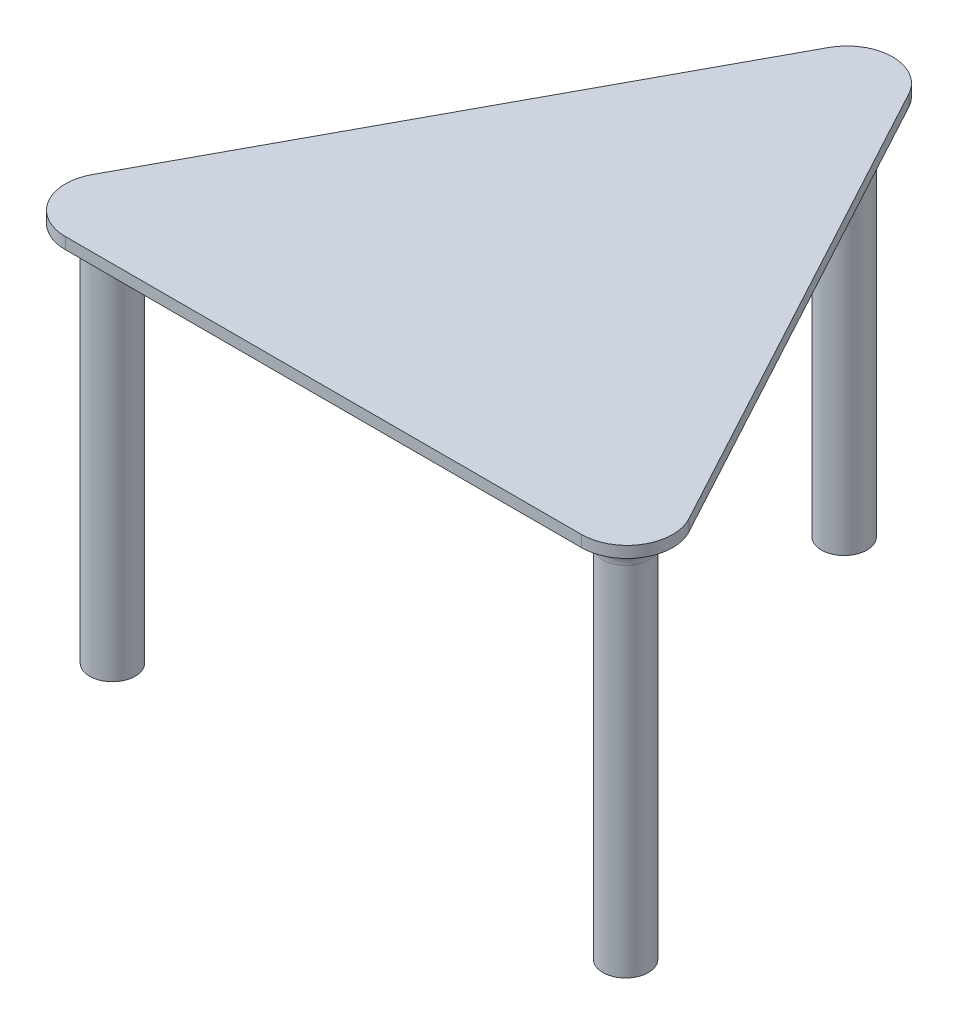
ISO-10303-21;
HEADER;
FILE_DESCRIPTION(('STEP AP214'),'2;1');
FILE_NAME('part.step','',(''),(''),'','','');
FILE_SCHEMA(('AUTOMOTIVE_DESIGN { 1 0 10303 214 1 1 1 1 }'));
ENDSEC;
DATA;
#1=APPLICATION_CONTEXT('core data for automotive mechanical design processes');
#2=APPLICATION_PROTOCOL_DEFINITION('international standard','automotive_design',2000,#1);
#3=PRODUCT_CONTEXT('',#1,'mechanical');
#4=PRODUCT('Part','Part','',(#3));
#5=PRODUCT_RELATED_PRODUCT_CATEGORY('part','',(#4));
#6=PRODUCT_DEFINITION_FORMATION('','',#4);
#7=PRODUCT_DEFINITION_CONTEXT('part definition',#1,'design');
#8=PRODUCT_DEFINITION('design','',#6,#7);
#9=PRODUCT_DEFINITION_SHAPE('','',#8);
#10=(LENGTH_UNIT() NAMED_UNIT(*) SI_UNIT(.MILLI.,.METRE.));
#11=(NAMED_UNIT(*) PLANE_ANGLE_UNIT() SI_UNIT($,.RADIAN.));
#12=(NAMED_UNIT(*) SI_UNIT($,.STERADIAN.) SOLID_ANGLE_UNIT());
#13=UNCERTAINTY_MEASURE_WITH_UNIT(LENGTH_MEASURE(1.E-05),#10,'distance_accuracy_value','');
#14=(GEOMETRIC_REPRESENTATION_CONTEXT(3) GLOBAL_UNCERTAINTY_ASSIGNED_CONTEXT((#13)) GLOBAL_UNIT_ASSIGNED_CONTEXT((#10,
#11,#12)) REPRESENTATION_CONTEXT('',''));
#15=CARTESIAN_POINT('',(0.,0.,0.));
#16=DIRECTION('',(0.,0.,1.));
#17=DIRECTION('',(1.,0.,0.));
#18=AXIS2_PLACEMENT_3D('',#15,#16,#17);
#19=CARTESIAN_POINT('',(0.,1.2,21.9757326007326));
#20=DIRECTION('',(0.,0.,-1.));
#21=DIRECTION('',(-1.,0.,0.));
#22=AXIS2_PLACEMENT_3D('',#19,#20,#21);
#23=PLANE('',#22);
#24=DIRECTION('',(1.,0.,0.));
#25=VECTOR('',#24,1.);
#26=CARTESIAN_POINT('',(0.,0.,21.9757326007326));
#27=LINE('',#26,#25);
#28=CARTESIAN_POINT('',(-68.0914658167259,0.,21.9757326007326));
#29=VERTEX_POINT('',#28);
#30=CARTESIAN_POINT('',(-67.9377289377289,0.,21.9757326007326));
#31=VERTEX_POINT('',#30);
#32=EDGE_CURVE('E252',#29,#31,#27,.T.);
#33=ORIENTED_EDGE('',*,*,#32,.T.);
#34=CARTESIAN_POINT('',(-13.9377289377289,0.,21.9757326007326));
#35=VERTEX_POINT('',#34);
#36=EDGE_CURVE('E255',#31,#35,#27,.T.);
#37=ORIENTED_EDGE('',*,*,#36,.T.);
#38=CARTESIAN_POINT('',(-13.7839920587319,0.,21.9757326007326));
#39=VERTEX_POINT('',#38);
#40=EDGE_CURVE('E115',#35,#39,#27,.T.);
#41=ORIENTED_EDGE('',*,*,#40,.T.);
#42=DIRECTION('',(0.,-1.,0.));
#43=VECTOR('',#42,1.);
#44=CARTESIAN_POINT('',(-13.7839920587319,1.2,21.9757326007326));
#45=LINE('',#44,#43);
#46=CARTESIAN_POINT('',(-13.7839920587319,1.2,21.9757326007326));
#47=VERTEX_POINT('',#46);
#48=EDGE_CURVE('E96',#47,#39,#45,.T.);
#49=ORIENTED_EDGE('',*,*,#48,.F.);
#50=DIRECTION('',(1.,0.,0.));
#51=VECTOR('',#50,1.);
#52=CARTESIAN_POINT('',(0.,1.2,21.9757326007326));
#53=LINE('',#52,#51);
#54=CARTESIAN_POINT('',(-68.0914658167259,1.2,21.9757326007326));
#55=VERTEX_POINT('',#54);
#56=EDGE_CURVE('E102',#55,#47,#53,.T.);
#57=ORIENTED_EDGE('',*,*,#56,.F.);
#58=DIRECTION('',(0.,-1.,0.));
#59=VECTOR('',#58,1.);
#60=CARTESIAN_POINT('',(-68.0914658167259,1.2,21.9757326007326));
#61=LINE('',#60,#59);
#62=EDGE_CURVE('E251',#55,#29,#61,.T.);
#63=ORIENTED_EDGE('',*,*,#62,.T.);
#64=EDGE_LOOP('',(#33,#37,#41,#49,#57,#63));
#65=FACE_BOUND('',#64,.T.);
#66=ADVANCED_FACE('F35',(#65),#23,.F.);
#67=CARTESIAN_POINT('',(-13.7839920587319,1.2,17.1757326007326));
#68=DIRECTION('',(0.,-1.,0.));
#69=DIRECTION('',(0.,0.,-1.));
#70=AXIS2_PLACEMENT_3D('',#67,#68,#69);
#71=CYLINDRICAL_SURFACE('',#70,4.8);
#72=CARTESIAN_POINT('',(-13.7839920587319,0.,17.1757326007326));
#73=DIRECTION('',(0.,1.,0.));
#74=DIRECTION('',(0.,0.,1.));
#75=AXIS2_PLACEMENT_3D('',#72,#73,#74);
#76=CIRCLE('',#75,4.8);
#77=CARTESIAN_POINT('',(-9.56022949463293,0.,14.8954190691945));
#78=VERTEX_POINT('',#77);
#79=EDGE_CURVE('E254',#39,#78,#76,.T.);
#80=ORIENTED_EDGE('',*,*,#79,.T.);
#81=DIRECTION('',(0.,-1.,0.));
#82=VECTOR('',#81,1.);
#83=CARTESIAN_POINT('',(-9.56022949463293,1.2,14.8954190691945));
#84=LINE('',#83,#82);
#85=CARTESIAN_POINT('',(-9.56022949463293,1.2,14.8954190691945));
#86=VERTEX_POINT('',#85);
#87=EDGE_CURVE('E98',#86,#78,#84,.T.);
#88=ORIENTED_EDGE('',*,*,#87,.F.);
#89=CARTESIAN_POINT('',(-13.7839920587319,1.2,17.1757326007326));
#90=DIRECTION('',(0.,1.,0.));
#91=DIRECTION('',(0.,0.,1.));
#92=AXIS2_PLACEMENT_3D('',#89,#90,#91);
#93=CIRCLE('',#92,4.8);
#94=EDGE_CURVE('E92',#47,#86,#93,.T.);
#95=ORIENTED_EDGE('',*,*,#94,.F.);
#96=ORIENTED_EDGE('',*,*,#48,.T.);
#97=EDGE_LOOP('',(#80,#88,#95,#96));
#98=FACE_BOUND('',#97,.T.);
#99=ADVANCED_FACE('F94',(#98),#71,.T.);
#100=CARTESIAN_POINT('',(-13.629400768555,1.2,7.358204095907));
#101=DIRECTION('',(-0.879950534187292,0.,0.47506531907044));
#102=DIRECTION('',(0.47506531907044,0.,0.879950534187292));
#103=AXIS2_PLACEMENT_3D('',#100,#101,#102);
#104=PLANE('',#103);
#105=DIRECTION('',(-0.47506531907044,0.,-0.879950534187292));
#106=VECTOR('',#105,1.);
#107=CARTESIAN_POINT('',(-13.629400768555,0.,7.358204095907));
#108=LINE('',#107,#106);
#109=CARTESIAN_POINT('',(-36.7139663736299,0.,-35.4007071953113));
#110=VERTEX_POINT('',#109);
#111=EDGE_CURVE('E257',#78,#110,#108,.T.);
#112=ORIENTED_EDGE('',*,*,#111,.T.);
#113=DIRECTION('',(0.,-1.,0.));
#114=VECTOR('',#113,1.);
#115=CARTESIAN_POINT('',(-36.7139663736299,1.2,-35.4007071953113));
#116=LINE('',#115,#114);
#117=CARTESIAN_POINT('',(-36.7139663736299,1.2,-35.4007071953113));
#118=VERTEX_POINT('',#117);
#119=EDGE_CURVE('E122',#118,#110,#116,.T.);
#120=ORIENTED_EDGE('',*,*,#119,.F.);
#121=DIRECTION('',(-0.47506531907044,0.,-0.879950534187292));
#122=VECTOR('',#121,1.);
#123=CARTESIAN_POINT('',(-13.629400768555,1.2,7.358204095907));
#124=LINE('',#123,#122);
#125=EDGE_CURVE('E101',#86,#118,#124,.T.);
#126=ORIENTED_EDGE('',*,*,#125,.F.);
#127=ORIENTED_EDGE('',*,*,#87,.T.);
#128=EDGE_LOOP('',(#112,#120,#126,#127));
#129=FACE_BOUND('',#128,.T.);
#130=ADVANCED_FACE('F160',(#129),#104,.F.);
#131=CARTESIAN_POINT('',(-40.9377289377289,1.2,-33.1203936637732));
#132=DIRECTION('',(0.,-1.,0.));
#133=DIRECTION('',(0.,0.,-1.));
#134=AXIS2_PLACEMENT_3D('',#131,#132,#133);
#135=CYLINDRICAL_SURFACE('',#134,4.8);
#136=CARTESIAN_POINT('',(-40.9377289377289,0.,-33.1203936637732));
#137=DIRECTION('',(0.,1.,0.));
#138=DIRECTION('',(0.,0.,1.));
#139=AXIS2_PLACEMENT_3D('',#136,#137,#138);
#140=CIRCLE('',#139,4.8);
#141=CARTESIAN_POINT('',(-45.1614915018279,0.,-35.4007071953113));
#142=VERTEX_POINT('',#141);
#143=EDGE_CURVE('E259',#110,#142,#140,.T.);
#144=ORIENTED_EDGE('',*,*,#143,.T.);
#145=DIRECTION('',(0.,-1.,0.));
#146=VECTOR('',#145,1.);
#147=CARTESIAN_POINT('',(-45.1614915018279,1.2,-35.4007071953113));
#148=LINE('',#147,#146);
#149=CARTESIAN_POINT('',(-45.1614915018279,1.2,-35.4007071953113));
#150=VERTEX_POINT('',#149);
#151=EDGE_CURVE('E269',#150,#142,#148,.T.);
#152=ORIENTED_EDGE('',*,*,#151,.F.);
#153=CARTESIAN_POINT('',(-40.9377289377289,1.2,-33.1203936637732));
#154=DIRECTION('',(0.,1.,0.));
#155=DIRECTION('',(0.,0.,1.));
#156=AXIS2_PLACEMENT_3D('',#153,#154,#155);
#157=CIRCLE('',#156,4.8);
#158=EDGE_CURVE('E246',#118,#150,#157,.T.);
#159=ORIENTED_EDGE('',*,*,#158,.F.);
#160=ORIENTED_EDGE('',*,*,#119,.T.);
#161=EDGE_LOOP('',(#144,#152,#159,#160));
#162=FACE_BOUND('',#161,.T.);
#163=ADVANCED_FACE('F165',(#162),#135,.T.);
#164=CARTESIAN_POINT('',(-49.7678259470641,1.2,-26.8685195297033));
#165=DIRECTION('',(0.879950534187292,0.,0.47506531907044));
#166=DIRECTION('',(0.47506531907044,0.,-0.879950534187292));
#167=AXIS2_PLACEMENT_3D('',#164,#165,#166);
#168=PLANE('',#167);
#169=DIRECTION('',(-0.47506531907044,0.,0.879950534187292));
#170=VECTOR('',#169,1.);
#171=CARTESIAN_POINT('',(-49.7678259470641,0.,-26.8685195297033));
#172=LINE('',#171,#170);
#173=CARTESIAN_POINT('',(-72.3152283808249,0.,14.8954190691945));
#174=VERTEX_POINT('',#173);
#175=EDGE_CURVE('E261',#142,#174,#172,.T.);
#176=ORIENTED_EDGE('',*,*,#175,.T.);
#177=DIRECTION('',(0.,-1.,0.));
#178=VECTOR('',#177,1.);
#179=CARTESIAN_POINT('',(-72.3152283808249,1.2,14.8954190691945));
#180=LINE('',#179,#178);
#181=CARTESIAN_POINT('',(-72.3152283808249,1.2,14.8954190691945));
#182=VERTEX_POINT('',#181);
#183=EDGE_CURVE('E267',#182,#174,#180,.T.);
#184=ORIENTED_EDGE('',*,*,#183,.F.);
#185=DIRECTION('',(-0.47506531907044,0.,0.879950534187292));
#186=VECTOR('',#185,1.);
#187=CARTESIAN_POINT('',(-49.7678259470641,1.2,-26.8685195297033));
#188=LINE('',#187,#186);
#189=EDGE_CURVE('E248',#150,#182,#188,.T.);
#190=ORIENTED_EDGE('',*,*,#189,.F.);
#191=ORIENTED_EDGE('',*,*,#151,.T.);
#192=EDGE_LOOP('',(#176,#184,#190,#191));
#193=FACE_BOUND('',#192,.T.);
#194=ADVANCED_FACE('F169',(#193),#168,.F.);
#195=CARTESIAN_POINT('',(-68.0914658167259,1.2,17.1757326007326));
#196=DIRECTION('',(0.,-1.,0.));
#197=DIRECTION('',(0.,0.,-1.));
#198=AXIS2_PLACEMENT_3D('',#195,#196,#197);
#199=CYLINDRICAL_SURFACE('',#198,4.8);
#200=CARTESIAN_POINT('',(-68.0914658167259,0.,17.1757326007326));
#201=DIRECTION('',(0.,1.,0.));
#202=DIRECTION('',(0.,0.,1.));
#203=AXIS2_PLACEMENT_3D('',#200,#201,#202);
#204=CIRCLE('',#203,4.8);
#205=EDGE_CURVE('E110',#29,#174,#204,.F.);
#206=ORIENTED_EDGE('',*,*,#205,.F.);
#207=ORIENTED_EDGE('',*,*,#62,.F.);
#208=CARTESIAN_POINT('',(-68.0914658167259,1.2,17.1757326007326));
#209=DIRECTION('',(0.,1.,0.));
#210=DIRECTION('',(0.,0.,1.));
#211=AXIS2_PLACEMENT_3D('',#208,#209,#210);
#212=CIRCLE('',#211,4.8);
#213=EDGE_CURVE('E108',#55,#182,#212,.F.);
#214=ORIENTED_EDGE('',*,*,#213,.T.);
#215=ORIENTED_EDGE('',*,*,#183,.T.);
#216=EDGE_LOOP('',(#206,#207,#214,#215));
#217=FACE_BOUND('',#216,.T.);
#218=ADVANCED_FACE('F173',(#217),#199,.T.);
#219=CARTESIAN_POINT('',(0.,1.2,0.));
#220=DIRECTION('',(0.,1.,0.));
#221=DIRECTION('',(0.,0.,1.));
#222=AXIS2_PLACEMENT_3D('',#219,#220,#221);
#223=PLANE('',#222);
#224=ORIENTED_EDGE('',*,*,#56,.T.);
#225=ORIENTED_EDGE('',*,*,#94,.T.);
#226=ORIENTED_EDGE('',*,*,#125,.T.);
#227=ORIENTED_EDGE('',*,*,#158,.T.);
#228=ORIENTED_EDGE('',*,*,#189,.T.);
#229=ORIENTED_EDGE('',*,*,#213,.F.);
#230=EDGE_LOOP('',(#224,#225,#226,#227,#228,#229));
#231=FACE_BOUND('',#230,.T.);
#232=ADVANCED_FACE('F106',(#231),#223,.T.);
#233=CARTESIAN_POINT('',(0.,0.,0.));
#234=DIRECTION('',(0.,1.,0.));
#235=DIRECTION('',(0.,0.,1.));
#236=AXIS2_PLACEMENT_3D('',#233,#234,#235);
#237=PLANE('',#236);
#238=CARTESIAN_POINT('',(-40.9377289377289,0.,-32.8242673992674));
#239=DIRECTION('',(0.,1.,0.));
#240=DIRECTION('',(0.,0.,1.));
#241=AXIS2_PLACEMENT_3D('',#238,#239,#240);
#242=CIRCLE('',#241,4.8);
#243=CARTESIAN_POINT('',(-40.9377289377289,0.,-28.0242673992674));
#244=VERTEX_POINT('',#243);
#245=EDGE_CURVE('E131',#244,#244,#242,.T.);
#246=ORIENTED_EDGE('',*,*,#245,.T.);
#247=EDGE_LOOP('',(#246));
#248=FACE_BOUND('',#247,.T.);
#249=ORIENTED_EDGE('',*,*,#36,.F.);
#250=CARTESIAN_POINT('',(-67.9377289377289,0.,17.1757326007326));
#251=DIRECTION('',(0.,1.,0.));
#252=DIRECTION('',(0.,0.,1.));
#253=AXIS2_PLACEMENT_3D('',#250,#251,#252);
#254=CIRCLE('',#253,4.8);
#255=EDGE_CURVE('E53',#31,#31,#254,.T.);
#256=ORIENTED_EDGE('',*,*,#255,.T.);
#257=ORIENTED_EDGE('',*,*,#32,.F.);
#258=ORIENTED_EDGE('',*,*,#205,.T.);
#259=ORIENTED_EDGE('',*,*,#175,.F.);
#260=ORIENTED_EDGE('',*,*,#143,.F.);
#261=ORIENTED_EDGE('',*,*,#111,.F.);
#262=ORIENTED_EDGE('',*,*,#79,.F.);
#263=ORIENTED_EDGE('',*,*,#40,.F.);
#264=CARTESIAN_POINT('',(-13.9377289377289,0.,17.1757326007326));
#265=DIRECTION('',(0.,1.,0.));
#266=DIRECTION('',(0.,0.,1.));
#267=AXIS2_PLACEMENT_3D('',#264,#265,#266);
#268=CIRCLE('',#267,4.8);
#269=EDGE_CURVE('E48',#35,#35,#268,.T.);
#270=ORIENTED_EDGE('',*,*,#269,.T.);
#271=EDGE_LOOP('',(#249,#256,#257,#258,#259,#260,#261,#262,#263,#270));
#272=FACE_BOUND('',#271,.T.);
#273=ADVANCED_FACE('F178',(#248,#272),#237,.F.);
#274=CARTESIAN_POINT('',(-40.9377289377289,-40.,-32.8242673992674));
#275=DIRECTION('',(0.,1.,0.));
#276=DIRECTION('',(0.,0.,1.));
#277=AXIS2_PLACEMENT_3D('',#274,#275,#276);
#278=CYLINDRICAL_SURFACE('',#277,0.999999999999998);
#279=CARTESIAN_POINT('',(-40.9377289377289,-40.,-32.8242673992674));
#280=DIRECTION('',(0.,1.,0.));
#281=DIRECTION('',(0.,0.,1.));
#282=AXIS2_PLACEMENT_3D('',#279,#280,#281);
#283=CIRCLE('',#282,0.999999999999998);
#284=CARTESIAN_POINT('',(-40.9377289377289,-40.,-31.8242673992674));
#285=VERTEX_POINT('',#284);
#286=EDGE_CURVE('E239',#285,#285,#283,.T.);
#287=ORIENTED_EDGE('',*,*,#286,.F.);
#288=EDGE_LOOP('',(#287));
#289=FACE_BOUND('',#288,.T.);
#290=CARTESIAN_POINT('',(-40.9377289377289,0.,-32.8242673992674));
#291=DIRECTION('',(0.,1.,0.));
#292=DIRECTION('',(0.,0.,1.));
#293=AXIS2_PLACEMENT_3D('',#290,#291,#292);
#294=CIRCLE('',#293,0.999999999999998);
#295=CARTESIAN_POINT('',(-40.9377289377289,0.,-31.8242673992674));
#296=VERTEX_POINT('',#295);
#297=EDGE_CURVE('E117',#296,#296,#294,.T.);
#298=ORIENTED_EDGE('',*,*,#297,.T.);
#299=EDGE_LOOP('',(#298));
#300=FACE_BOUND('',#299,.T.);
#301=ADVANCED_FACE('F181',(#289,#300),#278,.F.);
#302=CARTESIAN_POINT('',(-40.9377289377289,-40.,-32.8242673992674));
#303=DIRECTION('',(0.,1.,0.));
#304=DIRECTION('',(0.,0.,1.));
#305=AXIS2_PLACEMENT_3D('',#302,#303,#304);
#306=CYLINDRICAL_SURFACE('',#305,2.4);
#307=CARTESIAN_POINT('',(-40.9377289377289,-2.4,-32.8242673992674));
#308=DIRECTION('',(0.,1.,0.));
#309=DIRECTION('',(0.,0.,1.));
#310=AXIS2_PLACEMENT_3D('',#307,#308,#309);
#311=CIRCLE('',#310,2.4);
#312=CARTESIAN_POINT('',(-40.9377289377289,-2.4,-30.4242673992674));
#313=VERTEX_POINT('',#312);
#314=EDGE_CURVE('E11',#313,#313,#311,.F.);
#315=ORIENTED_EDGE('',*,*,#314,.T.);
#316=EDGE_LOOP('',(#315));
#317=FACE_BOUND('',#316,.T.);
#318=CARTESIAN_POINT('',(-40.9377289377289,-40.,-32.8242673992674));
#319=DIRECTION('',(0.,1.,0.));
#320=DIRECTION('',(0.,0.,1.));
#321=AXIS2_PLACEMENT_3D('',#318,#319,#320);
#322=CIRCLE('',#321,2.4);
#323=CARTESIAN_POINT('',(-40.9377289377289,-40.,-30.4242673992674));
#324=VERTEX_POINT('',#323);
#325=EDGE_CURVE('E242',#324,#324,#322,.T.);
#326=ORIENTED_EDGE('',*,*,#325,.T.);
#327=EDGE_LOOP('',(#326));
#328=FACE_BOUND('',#327,.T.);
#329=ADVANCED_FACE('F188',(#317,#328),#306,.T.);
#330=CARTESIAN_POINT('',(0.,-40.,0.));
#331=DIRECTION('',(0.,1.,0.));
#332=DIRECTION('',(0.,0.,1.));
#333=AXIS2_PLACEMENT_3D('',#330,#331,#332);
#334=PLANE('',#333);
#335=ORIENTED_EDGE('',*,*,#286,.T.);
#336=EDGE_LOOP('',(#335));
#337=FACE_BOUND('',#336,.T.);
#338=ORIENTED_EDGE('',*,*,#325,.F.);
#339=EDGE_LOOP('',(#338));
#340=FACE_BOUND('',#339,.T.);
#341=ADVANCED_FACE('F192',(#337,#340),#334,.F.);
#342=ORIENTED_EDGE('',*,*,#297,.F.);
#343=EDGE_LOOP('',(#342));
#344=FACE_BOUND('',#343,.T.);
#345=ADVANCED_FACE('F183',(#344),#237,.F.);
#346=CARTESIAN_POINT('',(-67.9377289377289,-40.,17.1757326007326));
#347=DIRECTION('',(0.,1.,0.));
#348=DIRECTION('',(0.,0.,1.));
#349=AXIS2_PLACEMENT_3D('',#346,#347,#348);
#350=CYLINDRICAL_SURFACE('',#349,0.999999999999998);
#351=CARTESIAN_POINT('',(-67.9377289377289,-40.,17.1757326007326));
#352=DIRECTION('',(0.,1.,0.));
#353=DIRECTION('',(0.,0.,1.));
#354=AXIS2_PLACEMENT_3D('',#351,#352,#353);
#355=CIRCLE('',#354,0.999999999999998);
#356=CARTESIAN_POINT('',(-67.9377289377289,-40.,18.1757326007326));
#357=VERTEX_POINT('',#356);
#358=EDGE_CURVE('E230',#357,#357,#355,.T.);
#359=ORIENTED_EDGE('',*,*,#358,.F.);
#360=EDGE_LOOP('',(#359));
#361=FACE_BOUND('',#360,.T.);
#362=CARTESIAN_POINT('',(-67.9377289377289,0.,17.1757326007326));
#363=DIRECTION('',(0.,1.,0.));
#364=DIRECTION('',(0.,0.,1.));
#365=AXIS2_PLACEMENT_3D('',#362,#363,#364);
#366=CIRCLE('',#365,0.999999999999998);
#367=CARTESIAN_POINT('',(-67.9377289377289,0.,18.1757326007326));
#368=VERTEX_POINT('',#367);
#369=EDGE_CURVE('E120',#368,#368,#366,.T.);
#370=ORIENTED_EDGE('',*,*,#369,.T.);
#371=EDGE_LOOP('',(#370));
#372=FACE_BOUND('',#371,.T.);
#373=ADVANCED_FACE('F197',(#361,#372),#350,.F.);
#374=CARTESIAN_POINT('',(-67.9377289377289,-40.,17.1757326007326));
#375=DIRECTION('',(0.,1.,0.));
#376=DIRECTION('',(0.,0.,1.));
#377=AXIS2_PLACEMENT_3D('',#374,#375,#376);
#378=CYLINDRICAL_SURFACE('',#377,2.4);
#379=CARTESIAN_POINT('',(-67.9377289377289,-2.4,17.1757326007326));
#380=DIRECTION('',(0.,1.,0.));
#381=DIRECTION('',(0.,0.,1.));
#382=AXIS2_PLACEMENT_3D('',#379,#380,#381);
#383=CIRCLE('',#382,2.4);
#384=CARTESIAN_POINT('',(-67.9377289377289,-2.4,19.5757326007326));
#385=VERTEX_POINT('',#384);
#386=EDGE_CURVE('E136',#385,#385,#383,.F.);
#387=ORIENTED_EDGE('',*,*,#386,.T.);
#388=EDGE_LOOP('',(#387));
#389=FACE_BOUND('',#388,.T.);
#390=CARTESIAN_POINT('',(-67.9377289377289,-40.,17.1757326007326));
#391=DIRECTION('',(0.,1.,0.));
#392=DIRECTION('',(0.,0.,1.));
#393=AXIS2_PLACEMENT_3D('',#390,#391,#392);
#394=CIRCLE('',#393,2.4);
#395=CARTESIAN_POINT('',(-67.9377289377289,-40.,19.5757326007326));
#396=VERTEX_POINT('',#395);
#397=EDGE_CURVE('E233',#396,#396,#394,.T.);
#398=ORIENTED_EDGE('',*,*,#397,.T.);
#399=EDGE_LOOP('',(#398));
#400=FACE_BOUND('',#399,.T.);
#401=ADVANCED_FACE('F200',(#389,#400),#378,.T.);
#402=CARTESIAN_POINT('',(0.,-40.,0.));
#403=DIRECTION('',(0.,1.,0.));
#404=DIRECTION('',(0.,0.,1.));
#405=AXIS2_PLACEMENT_3D('',#402,#403,#404);
#406=PLANE('',#405);
#407=ORIENTED_EDGE('',*,*,#358,.T.);
#408=EDGE_LOOP('',(#407));
#409=FACE_BOUND('',#408,.T.);
#410=ORIENTED_EDGE('',*,*,#397,.F.);
#411=EDGE_LOOP('',(#410));
#412=FACE_BOUND('',#411,.T.);
#413=ADVANCED_FACE('F204',(#409,#412),#406,.F.);
#414=ORIENTED_EDGE('',*,*,#369,.F.);
#415=EDGE_LOOP('',(#414));
#416=FACE_BOUND('',#415,.T.);
#417=ADVANCED_FACE('F208',(#416),#237,.F.);
#418=CARTESIAN_POINT('',(-13.9377289377289,-40.,17.1757326007326));
#419=DIRECTION('',(0.,1.,0.));
#420=DIRECTION('',(0.,0.,1.));
#421=AXIS2_PLACEMENT_3D('',#418,#419,#420);
#422=CYLINDRICAL_SURFACE('',#421,1.);
#423=CARTESIAN_POINT('',(-13.9377289377289,-40.,17.1757326007326));
#424=DIRECTION('',(0.,1.,0.));
#425=DIRECTION('',(0.,0.,1.));
#426=AXIS2_PLACEMENT_3D('',#423,#424,#425);
#427=CIRCLE('',#426,1.);
#428=CARTESIAN_POINT('',(-13.9377289377289,-40.,18.1757326007326));
#429=VERTEX_POINT('',#428);
#430=EDGE_CURVE('E226',#429,#429,#427,.T.);
#431=ORIENTED_EDGE('',*,*,#430,.F.);
#432=EDGE_LOOP('',(#431));
#433=FACE_BOUND('',#432,.T.);
#434=CARTESIAN_POINT('',(-13.9377289377289,0.,17.1757326007326));
#435=DIRECTION('',(0.,1.,0.));
#436=DIRECTION('',(0.,0.,1.));
#437=AXIS2_PLACEMENT_3D('',#434,#435,#436);
#438=CIRCLE('',#437,1.);
#439=CARTESIAN_POINT('',(-13.9377289377289,0.,18.1757326007326));
#440=VERTEX_POINT('',#439);
#441=EDGE_CURVE('E128',#440,#440,#438,.T.);
#442=ORIENTED_EDGE('',*,*,#441,.T.);
#443=EDGE_LOOP('',(#442));
#444=FACE_BOUND('',#443,.T.);
#445=ADVANCED_FACE('F210',(#433,#444),#422,.F.);
#446=CARTESIAN_POINT('',(-13.9377289377289,-40.,17.1757326007326));
#447=DIRECTION('',(0.,1.,0.));
#448=DIRECTION('',(0.,0.,1.));
#449=AXIS2_PLACEMENT_3D('',#446,#447,#448);
#450=CYLINDRICAL_SURFACE('',#449,2.4);
#451=CARTESIAN_POINT('',(-13.9377289377289,-2.4,17.1757326007326));
#452=DIRECTION('',(0.,1.,0.));
#453=DIRECTION('',(0.,0.,1.));
#454=AXIS2_PLACEMENT_3D('',#451,#452,#453);
#455=CIRCLE('',#454,2.4);
#456=CARTESIAN_POINT('',(-13.9377289377289,-2.4,19.5757326007326));
#457=VERTEX_POINT('',#456);
#458=EDGE_CURVE('E43',#457,#457,#455,.F.);
#459=ORIENTED_EDGE('',*,*,#458,.T.);
#460=EDGE_LOOP('',(#459));
#461=FACE_BOUND('',#460,.T.);
#462=CARTESIAN_POINT('',(-13.9377289377289,-40.,17.1757326007326));
#463=DIRECTION('',(0.,1.,0.));
#464=DIRECTION('',(0.,0.,1.));
#465=AXIS2_PLACEMENT_3D('',#462,#463,#464);
#466=CIRCLE('',#465,2.4);
#467=CARTESIAN_POINT('',(-13.9377289377289,-40.,19.5757326007326));
#468=VERTEX_POINT('',#467);
#469=EDGE_CURVE('E229',#468,#468,#466,.T.);
#470=ORIENTED_EDGE('',*,*,#469,.T.);
#471=EDGE_LOOP('',(#470));
#472=FACE_BOUND('',#471,.T.);
#473=ADVANCED_FACE('F141',(#461,#472),#450,.T.);
#474=CARTESIAN_POINT('',(0.,-40.,0.));
#475=DIRECTION('',(0.,1.,0.));
#476=DIRECTION('',(0.,0.,1.));
#477=AXIS2_PLACEMENT_3D('',#474,#475,#476);
#478=PLANE('',#477);
#479=ORIENTED_EDGE('',*,*,#430,.T.);
#480=EDGE_LOOP('',(#479));
#481=FACE_BOUND('',#480,.T.);
#482=ORIENTED_EDGE('',*,*,#469,.F.);
#483=EDGE_LOOP('',(#482));
#484=FACE_BOUND('',#483,.T.);
#485=ADVANCED_FACE('F216',(#481,#484),#478,.F.);
#486=ORIENTED_EDGE('',*,*,#441,.F.);
#487=EDGE_LOOP('',(#486));
#488=FACE_BOUND('',#487,.T.);
#489=ADVANCED_FACE('F152',(#488),#237,.F.);
#490=CARTESIAN_POINT('',(-67.9377289377289,-2.4,17.1757326007326));
#491=DIRECTION('',(0.,1.,0.));
#492=DIRECTION('',(0.,0.,1.));
#493=AXIS2_PLACEMENT_3D('',#490,#491,#492);
#494=TOROIDAL_SURFACE('',#493,4.8,2.4);
#495=ORIENTED_EDGE('',*,*,#386,.F.);
#496=EDGE_LOOP('',(#495));
#497=FACE_BOUND('',#496,.T.);
#498=ORIENTED_EDGE('',*,*,#255,.F.);
#499=EDGE_LOOP('',(#498));
#500=FACE_BOUND('',#499,.T.);
#501=ADVANCED_FACE('F146',(#497,#500),#494,.F.);
#502=CARTESIAN_POINT('',(-13.9377289377289,-2.4,17.1757326007326));
#503=DIRECTION('',(0.,1.,0.));
#504=DIRECTION('',(0.,0.,1.));
#505=AXIS2_PLACEMENT_3D('',#502,#503,#504);
#506=TOROIDAL_SURFACE('',#505,4.8,2.4);
#507=ORIENTED_EDGE('',*,*,#458,.F.);
#508=EDGE_LOOP('',(#507));
#509=FACE_BOUND('',#508,.T.);
#510=ORIENTED_EDGE('',*,*,#269,.F.);
#511=EDGE_LOOP('',(#510));
#512=FACE_BOUND('',#511,.T.);
#513=ADVANCED_FACE('F144',(#509,#512),#506,.F.);
#514=CARTESIAN_POINT('',(-40.9377289377289,-2.4,-32.8242673992674));
#515=DIRECTION('',(0.,1.,0.));
#516=DIRECTION('',(0.,0.,1.));
#517=AXIS2_PLACEMENT_3D('',#514,#515,#516);
#518=TOROIDAL_SURFACE('',#517,4.8,2.4);
#519=ORIENTED_EDGE('',*,*,#314,.F.);
#520=EDGE_LOOP('',(#519));
#521=FACE_BOUND('',#520,.T.);
#522=ORIENTED_EDGE('',*,*,#245,.F.);
#523=EDGE_LOOP('',(#522));
#524=FACE_BOUND('',#523,.T.);
#525=ADVANCED_FACE('F37',(#521,#524),#518,.F.);
#526=CLOSED_SHELL('',(#66,#99,#130,#163,#194,#218,#232,#273,#301,#329,#341,#345,#373,#401,#413,
#417,#445,#473,#485,#489,#501,#513,#525));
#527=MANIFOLD_SOLID_BREP('B2',#526);
#528=ADVANCED_BREP_SHAPE_REPRESENTATION('',(#18,#527),#14);
#529=SHAPE_DEFINITION_REPRESENTATION(#9,#528);
ENDSEC;
END-ISO-10303-21;
